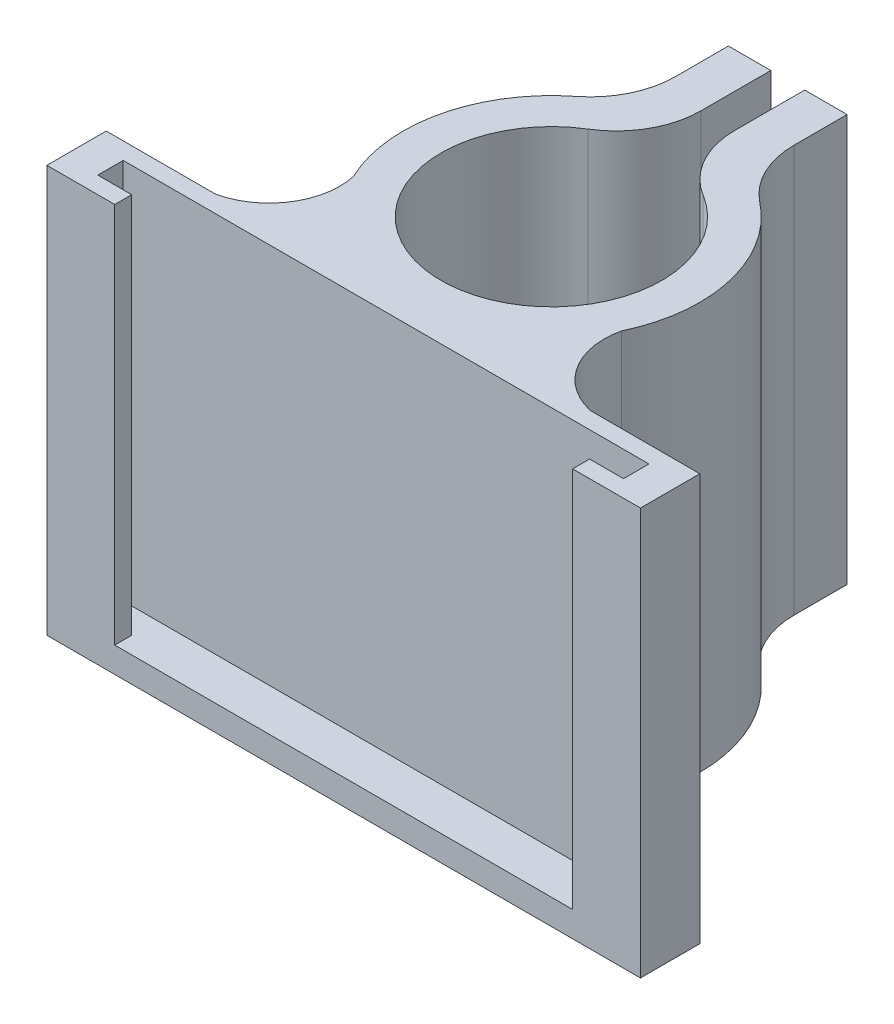
ISO-10303-21;
HEADER;
FILE_DESCRIPTION(('STEP AP214'),'2;1');
FILE_NAME('part.step','',(''),(''),'','','');
FILE_SCHEMA(('AUTOMOTIVE_DESIGN { 1 0 10303 214 1 1 1 1 }'));
ENDSEC;
DATA;
#1=APPLICATION_CONTEXT('core data for automotive mechanical design processes');
#2=APPLICATION_PROTOCOL_DEFINITION('international standard','automotive_design',2000,#1);
#3=PRODUCT_CONTEXT('',#1,'mechanical');
#4=PRODUCT('Part','Part','',(#3));
#5=PRODUCT_RELATED_PRODUCT_CATEGORY('part','',(#4));
#6=PRODUCT_DEFINITION_FORMATION('','',#4);
#7=PRODUCT_DEFINITION_CONTEXT('part definition',#1,'design');
#8=PRODUCT_DEFINITION('design','',#6,#7);
#9=PRODUCT_DEFINITION_SHAPE('','',#8);
#10=(LENGTH_UNIT() NAMED_UNIT(*) SI_UNIT(.MILLI.,.METRE.));
#11=(NAMED_UNIT(*) PLANE_ANGLE_UNIT() SI_UNIT($,.RADIAN.));
#12=(NAMED_UNIT(*) SI_UNIT($,.STERADIAN.) SOLID_ANGLE_UNIT());
#13=UNCERTAINTY_MEASURE_WITH_UNIT(LENGTH_MEASURE(1.E-05),#10,'distance_accuracy_value','');
#14=(GEOMETRIC_REPRESENTATION_CONTEXT(3) GLOBAL_UNCERTAINTY_ASSIGNED_CONTEXT((#13)) GLOBAL_UNIT_ASSIGNED_CONTEXT((#10,
#11,#12)) REPRESENTATION_CONTEXT('',''));
#15=CARTESIAN_POINT('',(0.,0.,0.));
#16=DIRECTION('',(0.,0.,1.));
#17=DIRECTION('',(1.,0.,0.));
#18=AXIS2_PLACEMENT_3D('',#15,#16,#17);
#19=CARTESIAN_POINT('',(7.,45.,-16.0390149323454));
#20=DIRECTION('',(-1.,0.,0.));
#21=DIRECTION('',(0.,0.,1.));
#22=AXIS2_PLACEMENT_3D('',#19,#20,#21);
#23=PLANE('',#22);
#24=DIRECTION('',(0.,0.,-1.));
#25=VECTOR('',#24,1.);
#26=CARTESIAN_POINT('',(7.,45.,-16.0390149323454));
#27=LINE('',#26,#25);
#28=CARTESIAN_POINT('',(7.,45.,-21.6159663212173));
#29=VERTEX_POINT('',#28);
#30=CARTESIAN_POINT('',(7.,45.,-27.8705332057378));
#31=VERTEX_POINT('',#30);
#32=EDGE_CURVE('E289',#29,#31,#27,.T.);
#33=ORIENTED_EDGE('',*,*,#32,.F.);
#34=DIRECTION('',(0.,1.,0.));
#35=VECTOR('',#34,1.);
#36=CARTESIAN_POINT('',(7.,-2.99999999999999,-21.6159663212173));
#37=LINE('',#36,#35);
#38=CARTESIAN_POINT('',(7.,-3.,-21.6159663212173));
#39=VERTEX_POINT('',#38);
#40=EDGE_CURVE('E422',#29,#39,#37,.F.);
#41=ORIENTED_EDGE('',*,*,#40,.T.);
#42=DIRECTION('',(0.,0.,1.));
#43=VECTOR('',#42,1.);
#44=CARTESIAN_POINT('',(7.,-3.,-16.0390149323454));
#45=LINE('',#44,#43);
#46=CARTESIAN_POINT('',(7.,-3.,-27.8705332057378));
#47=VERTEX_POINT('',#46);
#48=EDGE_CURVE('E275',#47,#39,#45,.T.);
#49=ORIENTED_EDGE('',*,*,#48,.F.);
#50=DIRECTION('',(0.,-1.,0.));
#51=VECTOR('',#50,1.);
#52=CARTESIAN_POINT('',(7.,45.,-27.8705332057378));
#53=LINE('',#52,#51);
#54=EDGE_CURVE('E403',#31,#47,#53,.T.);
#55=ORIENTED_EDGE('',*,*,#54,.F.);
#56=EDGE_LOOP('',(#33,#41,#49,#55));
#57=FACE_BOUND('',#56,.T.);
#58=ADVANCED_FACE('F33',(#57),#23,.F.);
#59=CARTESIAN_POINT('',(7.,45.,-27.8705332057378));
#60=DIRECTION('',(0.,0.,1.));
#61=DIRECTION('',(1.,0.,0.));
#62=AXIS2_PLACEMENT_3D('',#59,#60,#61);
#63=PLANE('',#62);
#64=ORIENTED_EDGE('',*,*,#54,.T.);
#65=DIRECTION('',(1.,0.,0.));
#66=VECTOR('',#65,1.);
#67=CARTESIAN_POINT('',(7.,-3.,-27.8705332057378));
#68=LINE('',#67,#66);
#69=CARTESIAN_POINT('',(2.,-3.,-27.8705332057378));
#70=VERTEX_POINT('',#69);
#71=EDGE_CURVE('E272',#70,#47,#68,.T.);
#72=ORIENTED_EDGE('',*,*,#71,.F.);
#73=DIRECTION('',(0.,-1.,0.));
#74=VECTOR('',#73,1.);
#75=CARTESIAN_POINT('',(2.,45.,-27.8705332057378));
#76=LINE('',#75,#74);
#77=CARTESIAN_POINT('',(2.,45.,-27.8705332057378));
#78=VERTEX_POINT('',#77);
#79=EDGE_CURVE('E401',#78,#70,#76,.T.);
#80=ORIENTED_EDGE('',*,*,#79,.F.);
#81=DIRECTION('',(-1.,0.,0.));
#82=VECTOR('',#81,1.);
#83=CARTESIAN_POINT('',(7.,45.,-27.8705332057378));
#84=LINE('',#83,#82);
#85=EDGE_CURVE('E291',#31,#78,#84,.T.);
#86=ORIENTED_EDGE('',*,*,#85,.F.);
#87=EDGE_LOOP('',(#64,#72,#80,#86));
#88=FACE_BOUND('',#87,.T.);
#89=ADVANCED_FACE('F478',(#88),#63,.F.);
#90=CARTESIAN_POINT('',(2.,45.,-18.8705332057378));
#91=DIRECTION('',(1.,0.,0.));
#92=DIRECTION('',(0.,0.,-1.));
#93=AXIS2_PLACEMENT_3D('',#90,#91,#92);
#94=PLANE('',#93);
#95=ORIENTED_EDGE('',*,*,#79,.T.);
#96=DIRECTION('',(0.,0.,-1.));
#97=VECTOR('',#96,1.);
#98=CARTESIAN_POINT('',(2.,-3.,-27.8705332057378));
#99=LINE('',#98,#97);
#100=CARTESIAN_POINT('',(2.,-3.,-19.6507156358235));
#101=VERTEX_POINT('',#100);
#102=EDGE_CURVE('E269',#101,#70,#99,.T.);
#103=ORIENTED_EDGE('',*,*,#102,.F.);
#104=DIRECTION('',(0.,-1.,0.));
#105=VECTOR('',#104,1.);
#106=CARTESIAN_POINT('',(2.,45.,-19.6507156358235));
#107=LINE('',#106,#105);
#108=CARTESIAN_POINT('',(2.,45.,-19.6507156358235));
#109=VERTEX_POINT('',#108);
#110=EDGE_CURVE('E409',#101,#109,#107,.F.);
#111=ORIENTED_EDGE('',*,*,#110,.T.);
#112=DIRECTION('',(0.,0.,1.));
#113=VECTOR('',#112,1.);
#114=CARTESIAN_POINT('',(2.,45.,-27.8705332057378));
#115=LINE('',#114,#113);
#116=EDGE_CURVE('E294',#78,#109,#115,.T.);
#117=ORIENTED_EDGE('',*,*,#116,.F.);
#118=EDGE_LOOP('',(#95,#103,#111,#117));
#119=FACE_BOUND('',#118,.T.);
#120=ADVANCED_FACE('F473',(#119),#94,.F.);
#121=CARTESIAN_POINT('',(0.,45.,0.));
#122=DIRECTION('',(0.,-1.,0.));
#123=DIRECTION('',(0.,0.,-1.));
#124=AXIS2_PLACEMENT_3D('',#121,#122,#123);
#125=CYLINDRICAL_SURFACE('',#124,13.025);
#126=CARTESIAN_POINT('',(0.,45.,0.));
#127=DIRECTION('',(0.,-1.,0.));
#128=DIRECTION('',(0.,0.,1.));
#129=AXIS2_PLACEMENT_3D('',#126,#127,#128);
#130=CIRCLE('',#129,13.025);
#131=CARTESIAN_POINT('',(6.78827361563518,45.,-11.1162028732509));
#132=VERTEX_POINT('',#131);
#133=CARTESIAN_POINT('',(-6.78827361563518,45.,-11.1162028732509));
#134=VERTEX_POINT('',#133);
#135=EDGE_CURVE('E297',#132,#134,#130,.T.);
#136=ORIENTED_EDGE('',*,*,#135,.F.);
#137=DIRECTION('',(0.,-1.,0.));
#138=VECTOR('',#137,1.);
#139=CARTESIAN_POINT('',(6.78827361563518,45.,-11.1162028732509));
#140=LINE('',#139,#138);
#141=CARTESIAN_POINT('',(6.78827361563518,-3.,-11.1162028732509));
#142=VERTEX_POINT('',#141);
#143=EDGE_CURVE('E407',#132,#142,#140,.T.);
#144=ORIENTED_EDGE('',*,*,#143,.T.);
#145=CARTESIAN_POINT('',(0.,-3.,0.));
#146=DIRECTION('',(0.,1.,0.));
#147=DIRECTION('',(0.,0.,-1.));
#148=AXIS2_PLACEMENT_3D('',#145,#146,#147);
#149=CIRCLE('',#148,13.025);
#150=CARTESIAN_POINT('',(-6.78827361563518,-3.,-11.1162028732509));
#151=VERTEX_POINT('',#150);
#152=EDGE_CURVE('E263',#151,#142,#149,.T.);
#153=ORIENTED_EDGE('',*,*,#152,.F.);
#154=DIRECTION('',(0.,-1.,0.));
#155=VECTOR('',#154,1.);
#156=CARTESIAN_POINT('',(-6.78827361563518,45.,-11.1162028732509));
#157=LINE('',#156,#155);
#158=EDGE_CURVE('E405',#151,#134,#157,.F.);
#159=ORIENTED_EDGE('',*,*,#158,.T.);
#160=EDGE_LOOP('',(#136,#144,#153,#159));
#161=FACE_BOUND('',#160,.T.);
#162=ADVANCED_FACE('F465',(#161),#125,.F.);
#163=CARTESIAN_POINT('',(-2.,45.,-27.8705332057378));
#164=DIRECTION('',(-1.,0.,0.));
#165=DIRECTION('',(0.,0.,1.));
#166=AXIS2_PLACEMENT_3D('',#163,#164,#165);
#167=PLANE('',#166);
#168=DIRECTION('',(0.,0.,-1.));
#169=VECTOR('',#168,1.);
#170=CARTESIAN_POINT('',(-2.,45.,-18.8705332057378));
#171=LINE('',#170,#169);
#172=CARTESIAN_POINT('',(-2.,45.,-19.6507156358235));
#173=VERTEX_POINT('',#172);
#174=CARTESIAN_POINT('',(-2.,45.,-27.8705332057378));
#175=VERTEX_POINT('',#174);
#176=EDGE_CURVE('E300',#173,#175,#171,.T.);
#177=ORIENTED_EDGE('',*,*,#176,.F.);
#178=DIRECTION('',(0.,-1.,0.));
#179=VECTOR('',#178,1.);
#180=CARTESIAN_POINT('',(-2.,45.,-19.6507156358235));
#181=LINE('',#180,#179);
#182=CARTESIAN_POINT('',(-2.,-3.,-19.6507156358235));
#183=VERTEX_POINT('',#182);
#184=EDGE_CURVE('E415',#173,#183,#181,.T.);
#185=ORIENTED_EDGE('',*,*,#184,.T.);
#186=DIRECTION('',(0.,0.,1.));
#187=VECTOR('',#186,1.);
#188=CARTESIAN_POINT('',(-2.,-3.,-19.6507156358235));
#189=LINE('',#188,#187);
#190=CARTESIAN_POINT('',(-2.,-3.,-27.8705332057378));
#191=VERTEX_POINT('',#190);
#192=EDGE_CURVE('E257',#191,#183,#189,.T.);
#193=ORIENTED_EDGE('',*,*,#192,.F.);
#194=DIRECTION('',(0.,-1.,0.));
#195=VECTOR('',#194,1.);
#196=CARTESIAN_POINT('',(-2.,45.,-27.8705332057378));
#197=LINE('',#196,#195);
#198=EDGE_CURVE('E399',#175,#191,#197,.T.);
#199=ORIENTED_EDGE('',*,*,#198,.F.);
#200=EDGE_LOOP('',(#177,#185,#193,#199));
#201=FACE_BOUND('',#200,.T.);
#202=ADVANCED_FACE('F456',(#201),#167,.F.);
#203=CARTESIAN_POINT('',(-7.,45.,-27.8705332057378));
#204=DIRECTION('',(0.,0.,1.));
#205=DIRECTION('',(1.,0.,0.));
#206=AXIS2_PLACEMENT_3D('',#203,#204,#205);
#207=PLANE('',#206);
#208=ORIENTED_EDGE('',*,*,#198,.T.);
#209=DIRECTION('',(1.,0.,0.));
#210=VECTOR('',#209,1.);
#211=CARTESIAN_POINT('',(-2.,-3.,-27.8705332057378));
#212=LINE('',#211,#210);
#213=CARTESIAN_POINT('',(-7.,-3.,-27.8705332057378));
#214=VERTEX_POINT('',#213);
#215=EDGE_CURVE('E254',#214,#191,#212,.T.);
#216=ORIENTED_EDGE('',*,*,#215,.F.);
#217=DIRECTION('',(0.,-1.,0.));
#218=VECTOR('',#217,1.);
#219=CARTESIAN_POINT('',(-7.,45.,-27.8705332057378));
#220=LINE('',#219,#218);
#221=CARTESIAN_POINT('',(-7.,45.,-27.8705332057378));
#222=VERTEX_POINT('',#221);
#223=EDGE_CURVE('E396',#222,#214,#220,.T.);
#224=ORIENTED_EDGE('',*,*,#223,.F.);
#225=DIRECTION('',(-1.,0.,0.));
#226=VECTOR('',#225,1.);
#227=CARTESIAN_POINT('',(-7.,45.,-27.8705332057378));
#228=LINE('',#227,#226);
#229=EDGE_CURVE('E302',#175,#222,#228,.T.);
#230=ORIENTED_EDGE('',*,*,#229,.F.);
#231=EDGE_LOOP('',(#208,#216,#224,#230));
#232=FACE_BOUND('',#231,.T.);
#233=ADVANCED_FACE('F450',(#232),#207,.F.);
#234=CARTESIAN_POINT('',(-7.,45.,-16.0390149323454));
#235=DIRECTION('',(1.,0.,0.));
#236=DIRECTION('',(0.,0.,-1.));
#237=AXIS2_PLACEMENT_3D('',#234,#235,#236);
#238=PLANE('',#237);
#239=DIRECTION('',(0.,0.,-1.));
#240=VECTOR('',#239,1.);
#241=CARTESIAN_POINT('',(-7.,-3.,-27.8705332057378));
#242=LINE('',#241,#240);
#243=CARTESIAN_POINT('',(-7.,-3.,-21.6159663212173));
#244=VERTEX_POINT('',#243);
#245=EDGE_CURVE('E252',#244,#214,#242,.T.);
#246=ORIENTED_EDGE('',*,*,#245,.F.);
#247=DIRECTION('',(0.,1.,0.));
#248=VECTOR('',#247,1.);
#249=CARTESIAN_POINT('',(-7.,45.,-21.6159663212173));
#250=LINE('',#249,#248);
#251=CARTESIAN_POINT('',(-7.,45.,-21.6159663212173));
#252=VERTEX_POINT('',#251);
#253=EDGE_CURVE('E420',#244,#252,#250,.T.);
#254=ORIENTED_EDGE('',*,*,#253,.T.);
#255=DIRECTION('',(0.,0.,1.));
#256=VECTOR('',#255,1.);
#257=CARTESIAN_POINT('',(-7.,45.,-16.0390149323454));
#258=LINE('',#257,#256);
#259=EDGE_CURVE('E304',#222,#252,#258,.T.);
#260=ORIENTED_EDGE('',*,*,#259,.F.);
#261=ORIENTED_EDGE('',*,*,#223,.T.);
#262=EDGE_LOOP('',(#246,#254,#260,#261));
#263=FACE_BOUND('',#262,.T.);
#264=ADVANCED_FACE('F445',(#263),#238,.F.);
#265=CARTESIAN_POINT('',(0.,45.,0.));
#266=DIRECTION('',(0.,-1.,0.));
#267=DIRECTION('',(0.,0.,-1.));
#268=AXIS2_PLACEMENT_3D('',#265,#266,#267);
#269=CYLINDRICAL_SURFACE('',#268,17.5);
#270=CARTESIAN_POINT('',(0.,45.,0.));
#271=DIRECTION('',(0.,1.,0.));
#272=DIRECTION('',(0.,0.,1.));
#273=AXIS2_PLACEMENT_3D('',#270,#271,#272);
#274=CIRCLE('',#273,17.5);
#275=CARTESIAN_POINT('',(-10.8181818181818,45.,-13.7556149316837));
#276=VERTEX_POINT('',#275);
#277=CARTESIAN_POINT('',(-15.794877566593,45.,7.53470919520709));
#278=VERTEX_POINT('',#277);
#279=EDGE_CURVE('E307',#276,#278,#274,.T.);
#280=ORIENTED_EDGE('',*,*,#279,.F.);
#281=DIRECTION('',(0.,-1.,0.));
#282=VECTOR('',#281,1.);
#283=CARTESIAN_POINT('',(-10.8181818181818,45.,-13.7556149316837));
#284=LINE('',#283,#282);
#285=CARTESIAN_POINT('',(-10.8181818181818,-3.,-13.7556149316837));
#286=VERTEX_POINT('',#285);
#287=EDGE_CURVE('E417',#276,#286,#284,.T.);
#288=ORIENTED_EDGE('',*,*,#287,.T.);
#289=CARTESIAN_POINT('',(0.,-3.,0.));
#290=DIRECTION('',(0.,-1.,0.));
#291=DIRECTION('',(0.,0.,-1.));
#292=AXIS2_PLACEMENT_3D('',#289,#290,#291);
#293=CIRCLE('',#292,17.5);
#294=CARTESIAN_POINT('',(-15.794877566593,-3.,7.5347091952071));
#295=VERTEX_POINT('',#294);
#296=EDGE_CURVE('E249',#295,#286,#293,.T.);
#297=ORIENTED_EDGE('',*,*,#296,.F.);
#298=DIRECTION('',(0.,-1.,0.));
#299=VECTOR('',#298,1.);
#300=CARTESIAN_POINT('',(-15.794877566593,45.,7.53470919520709));
#301=LINE('',#300,#299);
#302=EDGE_CURVE('E394',#278,#295,#301,.T.);
#303=ORIENTED_EDGE('',*,*,#302,.F.);
#304=EDGE_LOOP('',(#280,#288,#297,#303));
#305=FACE_BOUND('',#304,.T.);
#306=ADVANCED_FACE('F439',(#305),#269,.T.);
#307=CARTESIAN_POINT('',(-23.9286772002406,45.,9.36620036635238));
#308=DIRECTION('',(0.,-1.,0.));
#309=DIRECTION('',(0.,0.,-1.));
#310=AXIS2_PLACEMENT_3D('',#307,#308,#309);
#311=CYLINDRICAL_SURFACE('',#310,8.33744903374584);
#312=ORIENTED_EDGE('',*,*,#302,.T.);
#313=CARTESIAN_POINT('',(-23.9286772002406,-3.,9.36620036635238));
#314=DIRECTION('',(0.,1.,0.));
#315=DIRECTION('',(0.,0.,-1.));
#316=AXIS2_PLACEMENT_3D('',#313,#314,#315);
#317=CIRCLE('',#316,8.33744903374584);
#318=CARTESIAN_POINT('',(-22.0971860290953,-3.,17.5));
#319=VERTEX_POINT('',#318);
#320=EDGE_CURVE('E236',#319,#295,#317,.T.);
#321=ORIENTED_EDGE('',*,*,#320,.F.);
#322=DIRECTION('',(0.,-1.,0.));
#323=VECTOR('',#322,1.);
#324=CARTESIAN_POINT('',(-22.0971860290953,45.,17.5));
#325=LINE('',#324,#323);
#326=CARTESIAN_POINT('',(-22.0971860290953,45.,17.5));
#327=VERTEX_POINT('',#326);
#328=EDGE_CURVE('E227',#327,#319,#325,.T.);
#329=ORIENTED_EDGE('',*,*,#328,.F.);
#330=CARTESIAN_POINT('',(-23.9286772002406,45.,9.36620036635238));
#331=DIRECTION('',(0.,-1.,0.));
#332=DIRECTION('',(0.,0.,1.));
#333=AXIS2_PLACEMENT_3D('',#330,#331,#332);
#334=CIRCLE('',#333,8.33744903374584);
#335=EDGE_CURVE('E309',#278,#327,#334,.T.);
#336=ORIENTED_EDGE('',*,*,#335,.F.);
#337=EDGE_LOOP('',(#312,#321,#329,#336));
#338=FACE_BOUND('',#337,.T.);
#339=ADVANCED_FACE('F511',(#338),#311,.F.);
#340=CARTESIAN_POINT('',(-22.0971860290953,45.,17.5));
#341=DIRECTION('',(0.,0.,1.));
#342=DIRECTION('',(1.,0.,0.));
#343=AXIS2_PLACEMENT_3D('',#340,#341,#342);
#344=PLANE('',#343);
#345=ORIENTED_EDGE('',*,*,#328,.T.);
#346=DIRECTION('',(1.,0.,0.));
#347=VECTOR('',#346,1.);
#348=CARTESIAN_POINT('',(-35.,-3.,17.5));
#349=LINE('',#348,#347);
#350=CARTESIAN_POINT('',(-35.,-3.,17.5));
#351=VERTEX_POINT('',#350);
#352=EDGE_CURVE('E231',#351,#319,#349,.T.);
#353=ORIENTED_EDGE('',*,*,#352,.F.);
#354=DIRECTION('',(0.,-1.,0.));
#355=VECTOR('',#354,1.);
#356=CARTESIAN_POINT('',(-35.,45.,17.5));
#357=LINE('',#356,#355);
#358=CARTESIAN_POINT('',(-35.,45.,17.5));
#359=VERTEX_POINT('',#358);
#360=EDGE_CURVE('E218',#359,#351,#357,.T.);
#361=ORIENTED_EDGE('',*,*,#360,.F.);
#362=DIRECTION('',(-1.,0.,0.));
#363=VECTOR('',#362,1.);
#364=CARTESIAN_POINT('',(-22.0971860290953,45.,17.5));
#365=LINE('',#364,#363);
#366=EDGE_CURVE('E311',#327,#359,#365,.T.);
#367=ORIENTED_EDGE('',*,*,#366,.F.);
#368=EDGE_LOOP('',(#345,#353,#361,#367));
#369=FACE_BOUND('',#368,.T.);
#370=ADVANCED_FACE('F232',(#369),#344,.F.);
#371=CARTESIAN_POINT('',(-35.,45.,17.5));
#372=DIRECTION('',(1.,0.,0.));
#373=DIRECTION('',(0.,0.,-1.));
#374=AXIS2_PLACEMENT_3D('',#371,#372,#373);
#375=PLANE('',#374);
#376=ORIENTED_EDGE('',*,*,#360,.T.);
#377=DIRECTION('',(0.,0.,-1.));
#378=VECTOR('',#377,1.);
#379=CARTESIAN_POINT('',(-35.,-3.,24.5));
#380=LINE('',#379,#378);
#381=CARTESIAN_POINT('',(-35.,-3.,24.5));
#382=VERTEX_POINT('',#381);
#383=EDGE_CURVE('E223',#382,#351,#380,.T.);
#384=ORIENTED_EDGE('',*,*,#383,.F.);
#385=DIRECTION('',(0.,-1.,0.));
#386=VECTOR('',#385,1.);
#387=CARTESIAN_POINT('',(-35.,45.,24.5));
#388=LINE('',#387,#386);
#389=CARTESIAN_POINT('',(-35.,45.,24.5));
#390=VERTEX_POINT('',#389);
#391=EDGE_CURVE('E228',#390,#382,#388,.T.);
#392=ORIENTED_EDGE('',*,*,#391,.F.);
#393=DIRECTION('',(0.,0.,1.));
#394=VECTOR('',#393,1.);
#395=CARTESIAN_POINT('',(-35.,45.,17.5));
#396=LINE('',#395,#394);
#397=EDGE_CURVE('E224',#359,#390,#396,.T.);
#398=ORIENTED_EDGE('',*,*,#397,.F.);
#399=EDGE_LOOP('',(#376,#384,#392,#398));
#400=FACE_BOUND('',#399,.T.);
#401=ADVANCED_FACE('F220',(#400),#375,.F.);
#402=CARTESIAN_POINT('',(-27.,45.,24.5));
#403=DIRECTION('',(-1.,0.,0.));
#404=DIRECTION('',(0.,0.,1.));
#405=AXIS2_PLACEMENT_3D('',#402,#403,#404);
#406=PLANE('',#405);
#407=DIRECTION('',(0.,0.,-1.));
#408=VECTOR('',#407,1.);
#409=CARTESIAN_POINT('',(-27.,0.,24.5));
#410=LINE('',#409,#408);
#411=CARTESIAN_POINT('',(-27.,0.,24.5));
#412=VERTEX_POINT('',#411);
#413=CARTESIAN_POINT('',(-27.,0.,22.5));
#414=VERTEX_POINT('',#413);
#415=EDGE_CURVE('E287',#412,#414,#410,.T.);
#416=ORIENTED_EDGE('',*,*,#415,.T.);
#417=DIRECTION('',(0.,-1.,0.));
#418=VECTOR('',#417,1.);
#419=CARTESIAN_POINT('',(-27.,45.,22.5));
#420=LINE('',#419,#418);
#421=CARTESIAN_POINT('',(-27.,45.,22.5));
#422=VERTEX_POINT('',#421);
#423=EDGE_CURVE('E386',#422,#414,#420,.T.);
#424=ORIENTED_EDGE('',*,*,#423,.F.);
#425=DIRECTION('',(0.,0.,-1.));
#426=VECTOR('',#425,1.);
#427=CARTESIAN_POINT('',(-27.,45.,24.5));
#428=LINE('',#427,#426);
#429=CARTESIAN_POINT('',(-27.,45.,24.5));
#430=VERTEX_POINT('',#429);
#431=EDGE_CURVE('E316',#430,#422,#428,.T.);
#432=ORIENTED_EDGE('',*,*,#431,.F.);
#433=DIRECTION('',(0.,-1.,0.));
#434=VECTOR('',#433,1.);
#435=CARTESIAN_POINT('',(-27.,45.,24.5));
#436=LINE('',#435,#434);
#437=EDGE_CURVE('E389',#430,#412,#436,.T.);
#438=ORIENTED_EDGE('',*,*,#437,.T.);
#439=EDGE_LOOP('',(#416,#424,#432,#438));
#440=FACE_BOUND('',#439,.T.);
#441=ADVANCED_FACE('F579',(#440),#406,.F.);
#442=CARTESIAN_POINT('',(-27.,45.,22.5));
#443=DIRECTION('',(0.,0.,1.));
#444=DIRECTION('',(1.,0.,0.));
#445=AXIS2_PLACEMENT_3D('',#442,#443,#444);
#446=PLANE('',#445);
#447=DIRECTION('',(-1.,0.,0.));
#448=VECTOR('',#447,1.);
#449=CARTESIAN_POINT('',(-27.,0.,22.5));
#450=LINE('',#449,#448);
#451=CARTESIAN_POINT('',(-31.,0.,22.5));
#452=VERTEX_POINT('',#451);
#453=EDGE_CURVE('E343',#414,#452,#450,.T.);
#454=ORIENTED_EDGE('',*,*,#453,.T.);
#455=DIRECTION('',(0.,-1.,0.));
#456=VECTOR('',#455,1.);
#457=CARTESIAN_POINT('',(-31.,45.,22.5));
#458=LINE('',#457,#456);
#459=CARTESIAN_POINT('',(-31.,45.,22.5));
#460=VERTEX_POINT('',#459);
#461=EDGE_CURVE('E383',#460,#452,#458,.T.);
#462=ORIENTED_EDGE('',*,*,#461,.F.);
#463=DIRECTION('',(-1.,0.,0.));
#464=VECTOR('',#463,1.);
#465=CARTESIAN_POINT('',(-27.,45.,22.5));
#466=LINE('',#465,#464);
#467=EDGE_CURVE('E318',#422,#460,#466,.T.);
#468=ORIENTED_EDGE('',*,*,#467,.F.);
#469=ORIENTED_EDGE('',*,*,#423,.T.);
#470=EDGE_LOOP('',(#454,#462,#468,#469));
#471=FACE_BOUND('',#470,.T.);
#472=ADVANCED_FACE('F575',(#471),#446,.F.);
#473=CARTESIAN_POINT('',(-31.,45.,22.5));
#474=DIRECTION('',(-1.,0.,0.));
#475=DIRECTION('',(0.,0.,1.));
#476=AXIS2_PLACEMENT_3D('',#473,#474,#475);
#477=PLANE('',#476);
#478=DIRECTION('',(0.,0.,-1.));
#479=VECTOR('',#478,1.);
#480=CARTESIAN_POINT('',(-31.,0.,22.5));
#481=LINE('',#480,#479);
#482=CARTESIAN_POINT('',(-31.,0.,19.5));
#483=VERTEX_POINT('',#482);
#484=EDGE_CURVE('E346',#452,#483,#481,.T.);
#485=ORIENTED_EDGE('',*,*,#484,.T.);
#486=DIRECTION('',(0.,-1.,0.));
#487=VECTOR('',#486,1.);
#488=CARTESIAN_POINT('',(-31.,45.,19.5));
#489=LINE('',#488,#487);
#490=CARTESIAN_POINT('',(-31.,45.,19.5));
#491=VERTEX_POINT('',#490);
#492=EDGE_CURVE('E380',#491,#483,#489,.T.);
#493=ORIENTED_EDGE('',*,*,#492,.F.);
#494=DIRECTION('',(0.,0.,-1.));
#495=VECTOR('',#494,1.);
#496=CARTESIAN_POINT('',(-31.,45.,22.5));
#497=LINE('',#496,#495);
#498=EDGE_CURVE('E320',#460,#491,#497,.T.);
#499=ORIENTED_EDGE('',*,*,#498,.F.);
#500=ORIENTED_EDGE('',*,*,#461,.T.);
#501=EDGE_LOOP('',(#485,#493,#499,#500));
#502=FACE_BOUND('',#501,.T.);
#503=ADVANCED_FACE('F571',(#502),#477,.F.);
#504=CARTESIAN_POINT('',(31.,45.,19.5));
#505=DIRECTION('',(0.,0.,-1.));
#506=DIRECTION('',(-1.,0.,0.));
#507=AXIS2_PLACEMENT_3D('',#504,#505,#506);
#508=PLANE('',#507);
#509=DIRECTION('',(1.,0.,0.));
#510=VECTOR('',#509,1.);
#511=CARTESIAN_POINT('',(31.,0.,19.5));
#512=LINE('',#511,#510);
#513=CARTESIAN_POINT('',(31.,0.,19.5));
#514=VERTEX_POINT('',#513);
#515=EDGE_CURVE('E349',#483,#514,#512,.T.);
#516=ORIENTED_EDGE('',*,*,#515,.T.);
#517=DIRECTION('',(0.,-1.,0.));
#518=VECTOR('',#517,1.);
#519=CARTESIAN_POINT('',(31.,45.,19.5));
#520=LINE('',#519,#518);
#521=CARTESIAN_POINT('',(31.,45.,19.5));
#522=VERTEX_POINT('',#521);
#523=EDGE_CURVE('E377',#522,#514,#520,.T.);
#524=ORIENTED_EDGE('',*,*,#523,.F.);
#525=DIRECTION('',(1.,0.,0.));
#526=VECTOR('',#525,1.);
#527=CARTESIAN_POINT('',(31.,45.,19.5));
#528=LINE('',#527,#526);
#529=EDGE_CURVE('E322',#491,#522,#528,.T.);
#530=ORIENTED_EDGE('',*,*,#529,.F.);
#531=ORIENTED_EDGE('',*,*,#492,.T.);
#532=EDGE_LOOP('',(#516,#524,#530,#531));
#533=FACE_BOUND('',#532,.T.);
#534=ADVANCED_FACE('F567',(#533),#508,.F.);
#535=CARTESIAN_POINT('',(31.,45.,22.5));
#536=DIRECTION('',(1.,0.,0.));
#537=DIRECTION('',(0.,0.,-1.));
#538=AXIS2_PLACEMENT_3D('',#535,#536,#537);
#539=PLANE('',#538);
#540=DIRECTION('',(0.,0.,1.));
#541=VECTOR('',#540,1.);
#542=CARTESIAN_POINT('',(31.,0.,22.5));
#543=LINE('',#542,#541);
#544=CARTESIAN_POINT('',(31.,0.,22.5));
#545=VERTEX_POINT('',#544);
#546=EDGE_CURVE('E352',#514,#545,#543,.T.);
#547=ORIENTED_EDGE('',*,*,#546,.T.);
#548=DIRECTION('',(0.,-1.,0.));
#549=VECTOR('',#548,1.);
#550=CARTESIAN_POINT('',(31.,45.,22.5));
#551=LINE('',#550,#549);
#552=CARTESIAN_POINT('',(31.,45.,22.5));
#553=VERTEX_POINT('',#552);
#554=EDGE_CURVE('E374',#553,#545,#551,.T.);
#555=ORIENTED_EDGE('',*,*,#554,.F.);
#556=DIRECTION('',(0.,0.,1.));
#557=VECTOR('',#556,1.);
#558=CARTESIAN_POINT('',(31.,45.,22.5));
#559=LINE('',#558,#557);
#560=EDGE_CURVE('E324',#522,#553,#559,.T.);
#561=ORIENTED_EDGE('',*,*,#560,.F.);
#562=ORIENTED_EDGE('',*,*,#523,.T.);
#563=EDGE_LOOP('',(#547,#555,#561,#562));
#564=FACE_BOUND('',#563,.T.);
#565=ADVANCED_FACE('F563',(#564),#539,.F.);
#566=CARTESIAN_POINT('',(27.,45.,22.5));
#567=DIRECTION('',(0.,0.,1.));
#568=DIRECTION('',(1.,0.,0.));
#569=AXIS2_PLACEMENT_3D('',#566,#567,#568);
#570=PLANE('',#569);
#571=DIRECTION('',(-1.,0.,0.));
#572=VECTOR('',#571,1.);
#573=CARTESIAN_POINT('',(27.,0.,22.5));
#574=LINE('',#573,#572);
#575=CARTESIAN_POINT('',(27.,0.,22.5));
#576=VERTEX_POINT('',#575);
#577=EDGE_CURVE('E355',#545,#576,#574,.T.);
#578=ORIENTED_EDGE('',*,*,#577,.T.);
#579=DIRECTION('',(0.,-1.,0.));
#580=VECTOR('',#579,1.);
#581=CARTESIAN_POINT('',(27.,45.,22.5));
#582=LINE('',#581,#580);
#583=CARTESIAN_POINT('',(27.,45.,22.5));
#584=VERTEX_POINT('',#583);
#585=EDGE_CURVE('E371',#584,#576,#582,.T.);
#586=ORIENTED_EDGE('',*,*,#585,.F.);
#587=DIRECTION('',(-1.,0.,0.));
#588=VECTOR('',#587,1.);
#589=CARTESIAN_POINT('',(27.,45.,22.5));
#590=LINE('',#589,#588);
#591=EDGE_CURVE('E326',#553,#584,#590,.T.);
#592=ORIENTED_EDGE('',*,*,#591,.F.);
#593=ORIENTED_EDGE('',*,*,#554,.T.);
#594=EDGE_LOOP('',(#578,#586,#592,#593));
#595=FACE_BOUND('',#594,.T.);
#596=ADVANCED_FACE('F559',(#595),#570,.F.);
#597=CARTESIAN_POINT('',(27.,45.,24.5));
#598=DIRECTION('',(1.,0.,0.));
#599=DIRECTION('',(0.,0.,-1.));
#600=AXIS2_PLACEMENT_3D('',#597,#598,#599);
#601=PLANE('',#600);
#602=DIRECTION('',(0.,0.,1.));
#603=VECTOR('',#602,1.);
#604=CARTESIAN_POINT('',(27.,0.,24.5));
#605=LINE('',#604,#603);
#606=CARTESIAN_POINT('',(27.,0.,24.5));
#607=VERTEX_POINT('',#606);
#608=EDGE_CURVE('E292',#576,#607,#605,.T.);
#609=ORIENTED_EDGE('',*,*,#608,.T.);
#610=DIRECTION('',(0.,-1.,0.));
#611=VECTOR('',#610,1.);
#612=CARTESIAN_POINT('',(27.,45.,24.5));
#613=LINE('',#612,#611);
#614=CARTESIAN_POINT('',(27.,45.,24.5));
#615=VERTEX_POINT('',#614);
#616=EDGE_CURVE('E368',#615,#607,#613,.T.);
#617=ORIENTED_EDGE('',*,*,#616,.F.);
#618=DIRECTION('',(0.,0.,1.));
#619=VECTOR('',#618,1.);
#620=CARTESIAN_POINT('',(27.,45.,24.5));
#621=LINE('',#620,#619);
#622=EDGE_CURVE('E328',#584,#615,#621,.T.);
#623=ORIENTED_EDGE('',*,*,#622,.F.);
#624=ORIENTED_EDGE('',*,*,#585,.T.);
#625=EDGE_LOOP('',(#609,#617,#623,#624));
#626=FACE_BOUND('',#625,.T.);
#627=ADVANCED_FACE('F556',(#626),#601,.F.);
#628=CARTESIAN_POINT('',(35.,45.,24.5));
#629=DIRECTION('',(0.,0.,-1.));
#630=DIRECTION('',(-1.,0.,0.));
#631=AXIS2_PLACEMENT_3D('',#628,#629,#630);
#632=PLANE('',#631);
#633=ORIENTED_EDGE('',*,*,#616,.T.);
#634=DIRECTION('',(-1.,0.,0.));
#635=VECTOR('',#634,1.);
#636=CARTESIAN_POINT('',(-35.,0.,24.5));
#637=LINE('',#636,#635);
#638=EDGE_CURVE('E243',#607,#412,#637,.T.);
#639=ORIENTED_EDGE('',*,*,#638,.T.);
#640=ORIENTED_EDGE('',*,*,#437,.F.);
#641=DIRECTION('',(1.,0.,0.));
#642=VECTOR('',#641,1.);
#643=CARTESIAN_POINT('',(-35.,45.,24.5));
#644=LINE('',#643,#642);
#645=EDGE_CURVE('E314',#390,#430,#644,.T.);
#646=ORIENTED_EDGE('',*,*,#645,.F.);
#647=ORIENTED_EDGE('',*,*,#391,.T.);
#648=DIRECTION('',(-1.,0.,0.));
#649=VECTOR('',#648,1.);
#650=CARTESIAN_POINT('',(-35.,-3.,24.5));
#651=LINE('',#650,#649);
#652=CARTESIAN_POINT('',(35.,-3.,24.5));
#653=VERTEX_POINT('',#652);
#654=EDGE_CURVE('E242',#653,#382,#651,.T.);
#655=ORIENTED_EDGE('',*,*,#654,.F.);
#656=DIRECTION('',(0.,-1.,0.));
#657=VECTOR('',#656,1.);
#658=CARTESIAN_POINT('',(35.,45.,24.5));
#659=LINE('',#658,#657);
#660=CARTESIAN_POINT('',(35.,45.,24.5));
#661=VERTEX_POINT('',#660);
#662=EDGE_CURVE('E366',#661,#653,#659,.T.);
#663=ORIENTED_EDGE('',*,*,#662,.F.);
#664=DIRECTION('',(1.,0.,0.));
#665=VECTOR('',#664,1.);
#666=CARTESIAN_POINT('',(35.,45.,24.5));
#667=LINE('',#666,#665);
#668=EDGE_CURVE('E330',#615,#661,#667,.T.);
#669=ORIENTED_EDGE('',*,*,#668,.F.);
#670=EDGE_LOOP('',(#633,#639,#640,#646,#647,#655,#663,#669));
#671=FACE_BOUND('',#670,.T.);
#672=ADVANCED_FACE('F504',(#671),#632,.F.);
#673=CARTESIAN_POINT('',(35.,45.,17.5));
#674=DIRECTION('',(-1.,0.,0.));
#675=DIRECTION('',(0.,0.,1.));
#676=AXIS2_PLACEMENT_3D('',#673,#674,#675);
#677=PLANE('',#676);
#678=ORIENTED_EDGE('',*,*,#662,.T.);
#679=DIRECTION('',(0.,0.,1.));
#680=VECTOR('',#679,1.);
#681=CARTESIAN_POINT('',(35.,-3.,24.5));
#682=LINE('',#681,#680);
#683=CARTESIAN_POINT('',(35.,-3.,17.5));
#684=VERTEX_POINT('',#683);
#685=EDGE_CURVE('E285',#684,#653,#682,.T.);
#686=ORIENTED_EDGE('',*,*,#685,.F.);
#687=DIRECTION('',(0.,-1.,0.));
#688=VECTOR('',#687,1.);
#689=CARTESIAN_POINT('',(35.,45.,17.5));
#690=LINE('',#689,#688);
#691=CARTESIAN_POINT('',(35.,45.,17.5));
#692=VERTEX_POINT('',#691);
#693=EDGE_CURVE('E364',#692,#684,#690,.T.);
#694=ORIENTED_EDGE('',*,*,#693,.F.);
#695=DIRECTION('',(0.,0.,-1.));
#696=VECTOR('',#695,1.);
#697=CARTESIAN_POINT('',(35.,45.,17.5));
#698=LINE('',#697,#696);
#699=EDGE_CURVE('E332',#661,#692,#698,.T.);
#700=ORIENTED_EDGE('',*,*,#699,.F.);
#701=EDGE_LOOP('',(#678,#686,#694,#700));
#702=FACE_BOUND('',#701,.T.);
#703=ADVANCED_FACE('F501',(#702),#677,.F.);
#704=CARTESIAN_POINT('',(22.0971860290953,45.,17.5));
#705=DIRECTION('',(0.,0.,1.));
#706=DIRECTION('',(1.,0.,0.));
#707=AXIS2_PLACEMENT_3D('',#704,#705,#706);
#708=PLANE('',#707);
#709=ORIENTED_EDGE('',*,*,#693,.T.);
#710=DIRECTION('',(1.,0.,0.));
#711=VECTOR('',#710,1.);
#712=CARTESIAN_POINT('',(22.0971860290953,-3.,17.5));
#713=LINE('',#712,#711);
#714=CARTESIAN_POINT('',(22.0971860290953,-3.,17.5));
#715=VERTEX_POINT('',#714);
#716=EDGE_CURVE('E282',#715,#684,#713,.T.);
#717=ORIENTED_EDGE('',*,*,#716,.F.);
#718=DIRECTION('',(0.,-1.,0.));
#719=VECTOR('',#718,1.);
#720=CARTESIAN_POINT('',(22.0971860290953,45.,17.5));
#721=LINE('',#720,#719);
#722=CARTESIAN_POINT('',(22.0971860290953,45.,17.5));
#723=VERTEX_POINT('',#722);
#724=EDGE_CURVE('E362',#723,#715,#721,.T.);
#725=ORIENTED_EDGE('',*,*,#724,.F.);
#726=DIRECTION('',(-1.,0.,0.));
#727=VECTOR('',#726,1.);
#728=CARTESIAN_POINT('',(22.0971860290953,45.,17.5));
#729=LINE('',#728,#727);
#730=EDGE_CURVE('E334',#692,#723,#729,.T.);
#731=ORIENTED_EDGE('',*,*,#730,.F.);
#732=EDGE_LOOP('',(#709,#717,#725,#731));
#733=FACE_BOUND('',#732,.T.);
#734=ADVANCED_FACE('F496',(#733),#708,.F.);
#735=CARTESIAN_POINT('',(23.9286772002406,45.,9.36620036635238));
#736=DIRECTION('',(0.,-1.,0.));
#737=DIRECTION('',(0.,0.,-1.));
#738=AXIS2_PLACEMENT_3D('',#735,#736,#737);
#739=CYLINDRICAL_SURFACE('',#738,8.33744903374584);
#740=ORIENTED_EDGE('',*,*,#724,.T.);
#741=CARTESIAN_POINT('',(23.9286772002406,-3.,9.36620036635238));
#742=DIRECTION('',(0.,1.,0.));
#743=DIRECTION('',(0.,0.,-1.));
#744=AXIS2_PLACEMENT_3D('',#741,#742,#743);
#745=CIRCLE('',#744,8.33744903374584);
#746=CARTESIAN_POINT('',(15.794877566593,-3.,7.5347091952071));
#747=VERTEX_POINT('',#746);
#748=EDGE_CURVE('E279',#747,#715,#745,.T.);
#749=ORIENTED_EDGE('',*,*,#748,.F.);
#750=DIRECTION('',(0.,-1.,0.));
#751=VECTOR('',#750,1.);
#752=CARTESIAN_POINT('',(15.794877566593,45.,7.5347091952071));
#753=LINE('',#752,#751);
#754=CARTESIAN_POINT('',(15.794877566593,45.,7.5347091952071));
#755=VERTEX_POINT('',#754);
#756=EDGE_CURVE('E340',#755,#747,#753,.T.);
#757=ORIENTED_EDGE('',*,*,#756,.F.);
#758=CARTESIAN_POINT('',(23.9286772002406,45.,9.36620036635238));
#759=DIRECTION('',(0.,-1.,0.));
#760=DIRECTION('',(0.,0.,-1.));
#761=AXIS2_PLACEMENT_3D('',#758,#759,#760);
#762=CIRCLE('',#761,8.33744903374584);
#763=EDGE_CURVE('E336',#723,#755,#762,.T.);
#764=ORIENTED_EDGE('',*,*,#763,.F.);
#765=EDGE_LOOP('',(#740,#749,#757,#764));
#766=FACE_BOUND('',#765,.T.);
#767=ADVANCED_FACE('F491',(#766),#739,.F.);
#768=CARTESIAN_POINT('',(0.,45.,0.));
#769=DIRECTION('',(0.,-1.,0.));
#770=DIRECTION('',(0.,0.,-1.));
#771=AXIS2_PLACEMENT_3D('',#768,#769,#770);
#772=CYLINDRICAL_SURFACE('',#771,17.5);
#773=CARTESIAN_POINT('',(0.,-3.,0.));
#774=DIRECTION('',(0.,-1.,0.));
#775=DIRECTION('',(0.,0.,-1.));
#776=AXIS2_PLACEMENT_3D('',#773,#774,#775);
#777=CIRCLE('',#776,17.5);
#778=CARTESIAN_POINT('',(10.8181818181818,-3.,-13.7556149316837));
#779=VERTEX_POINT('',#778);
#780=EDGE_CURVE('E277',#779,#747,#777,.T.);
#781=ORIENTED_EDGE('',*,*,#780,.F.);
#782=DIRECTION('',(0.,-1.,0.));
#783=VECTOR('',#782,1.);
#784=CARTESIAN_POINT('',(10.8181818181818,45.,-13.7556149316837));
#785=LINE('',#784,#783);
#786=CARTESIAN_POINT('',(10.8181818181818,45.,-13.7556149316837));
#787=VERTEX_POINT('',#786);
#788=EDGE_CURVE('E48',#779,#787,#785,.F.);
#789=ORIENTED_EDGE('',*,*,#788,.T.);
#790=CARTESIAN_POINT('',(0.,45.,0.));
#791=DIRECTION('',(0.,1.,0.));
#792=DIRECTION('',(0.,0.,1.));
#793=AXIS2_PLACEMENT_3D('',#790,#791,#792);
#794=CIRCLE('',#793,17.5);
#795=EDGE_CURVE('E338',#755,#787,#794,.T.);
#796=ORIENTED_EDGE('',*,*,#795,.F.);
#797=ORIENTED_EDGE('',*,*,#756,.T.);
#798=EDGE_LOOP('',(#781,#789,#796,#797));
#799=FACE_BOUND('',#798,.T.);
#800=ADVANCED_FACE('F488',(#799),#772,.T.);
#801=CARTESIAN_POINT('',(0.,45.,0.));
#802=DIRECTION('',(0.,1.,0.));
#803=DIRECTION('',(0.,0.,1.));
#804=AXIS2_PLACEMENT_3D('',#801,#802,#803);
#805=PLANE('',#804);
#806=ORIENTED_EDGE('',*,*,#116,.T.);
#807=CARTESIAN_POINT('',(12.,45.,-19.6507156358235));
#808=DIRECTION('',(0.,1.,0.));
#809=DIRECTION('',(0.,0.,1.));
#810=AXIS2_PLACEMENT_3D('',#807,#808,#809);
#811=CIRCLE('',#810,10.);
#812=EDGE_CURVE('E413',#109,#132,#811,.T.);
#813=ORIENTED_EDGE('',*,*,#812,.T.);
#814=ORIENTED_EDGE('',*,*,#135,.T.);
#815=CARTESIAN_POINT('',(-12.,45.,-19.6507156358235));
#816=DIRECTION('',(0.,1.,0.));
#817=DIRECTION('',(0.,0.,1.));
#818=AXIS2_PLACEMENT_3D('',#815,#816,#817);
#819=CIRCLE('',#818,10.);
#820=EDGE_CURVE('E411',#134,#173,#819,.T.);
#821=ORIENTED_EDGE('',*,*,#820,.T.);
#822=ORIENTED_EDGE('',*,*,#176,.T.);
#823=ORIENTED_EDGE('',*,*,#229,.T.);
#824=ORIENTED_EDGE('',*,*,#259,.T.);
#825=CARTESIAN_POINT('',(-17.,45.,-21.6159663212173));
#826=DIRECTION('',(0.,1.,0.));
#827=DIRECTION('',(0.,0.,1.));
#828=AXIS2_PLACEMENT_3D('',#825,#826,#827);
#829=CIRCLE('',#828,10.);
#830=EDGE_CURVE('E428',#252,#276,#829,.F.);
#831=ORIENTED_EDGE('',*,*,#830,.T.);
#832=ORIENTED_EDGE('',*,*,#279,.T.);
#833=ORIENTED_EDGE('',*,*,#335,.T.);
#834=ORIENTED_EDGE('',*,*,#366,.T.);
#835=ORIENTED_EDGE('',*,*,#397,.T.);
#836=ORIENTED_EDGE('',*,*,#645,.T.);
#837=ORIENTED_EDGE('',*,*,#431,.T.);
#838=ORIENTED_EDGE('',*,*,#467,.T.);
#839=ORIENTED_EDGE('',*,*,#498,.T.);
#840=ORIENTED_EDGE('',*,*,#529,.T.);
#841=ORIENTED_EDGE('',*,*,#560,.T.);
#842=ORIENTED_EDGE('',*,*,#591,.T.);
#843=ORIENTED_EDGE('',*,*,#622,.T.);
#844=ORIENTED_EDGE('',*,*,#668,.T.);
#845=ORIENTED_EDGE('',*,*,#699,.T.);
#846=ORIENTED_EDGE('',*,*,#730,.T.);
#847=ORIENTED_EDGE('',*,*,#763,.T.);
#848=ORIENTED_EDGE('',*,*,#795,.T.);
#849=CARTESIAN_POINT('',(17.,45.,-21.6159663212173));
#850=DIRECTION('',(0.,1.,0.));
#851=DIRECTION('',(0.,0.,1.));
#852=AXIS2_PLACEMENT_3D('',#849,#850,#851);
#853=CIRCLE('',#852,10.);
#854=EDGE_CURVE('E11',#787,#29,#853,.F.);
#855=ORIENTED_EDGE('',*,*,#854,.T.);
#856=ORIENTED_EDGE('',*,*,#32,.T.);
#857=ORIENTED_EDGE('',*,*,#85,.T.);
#858=EDGE_LOOP('',(#806,#813,#814,#821,#822,#823,#824,#831,#832,#833,#834,#835,#836,#837,#838,
#839,#840,#841,#842,#843,#844,#845,#846,#847,#848,#855,#856,#857));
#859=FACE_BOUND('',#858,.T.);
#860=ADVANCED_FACE('F432',(#859),#805,.T.);
#861=CARTESIAN_POINT('',(12.,45.,-19.6507156358235));
#862=DIRECTION('',(0.,-1.,0.));
#863=DIRECTION('',(0.,0.,-1.));
#864=AXIS2_PLACEMENT_3D('',#861,#862,#863);
#865=CYLINDRICAL_SURFACE('',#864,10.);
#866=ORIENTED_EDGE('',*,*,#812,.F.);
#867=ORIENTED_EDGE('',*,*,#110,.F.);
#868=CARTESIAN_POINT('',(12.,-3.,-19.6507156358235));
#869=DIRECTION('',(0.,-1.,0.));
#870=DIRECTION('',(0.,0.,-1.));
#871=AXIS2_PLACEMENT_3D('',#868,#869,#870);
#872=CIRCLE('',#871,10.);
#873=EDGE_CURVE('E266',#142,#101,#872,.T.);
#874=ORIENTED_EDGE('',*,*,#873,.F.);
#875=ORIENTED_EDGE('',*,*,#143,.F.);
#876=EDGE_LOOP('',(#866,#867,#874,#875));
#877=FACE_BOUND('',#876,.T.);
#878=ADVANCED_FACE('F469',(#877),#865,.T.);
#879=CARTESIAN_POINT('',(-12.,45.,-19.6507156358235));
#880=DIRECTION('',(0.,-1.,0.));
#881=DIRECTION('',(0.,0.,-1.));
#882=AXIS2_PLACEMENT_3D('',#879,#880,#881);
#883=CYLINDRICAL_SURFACE('',#882,10.);
#884=ORIENTED_EDGE('',*,*,#820,.F.);
#885=ORIENTED_EDGE('',*,*,#158,.F.);
#886=CARTESIAN_POINT('',(-12.,-3.,-19.6507156358235));
#887=DIRECTION('',(0.,-1.,0.));
#888=DIRECTION('',(0.,0.,-1.));
#889=AXIS2_PLACEMENT_3D('',#886,#887,#888);
#890=CIRCLE('',#889,10.);
#891=EDGE_CURVE('E260',#183,#151,#890,.T.);
#892=ORIENTED_EDGE('',*,*,#891,.F.);
#893=ORIENTED_EDGE('',*,*,#184,.F.);
#894=EDGE_LOOP('',(#884,#885,#892,#893));
#895=FACE_BOUND('',#894,.T.);
#896=ADVANCED_FACE('F460',(#895),#883,.T.);
#897=CARTESIAN_POINT('',(-23.9286772002406,-3.,9.36620036635238));
#898=DIRECTION('',(0.,-1.,0.));
#899=DIRECTION('',(0.,0.,-1.));
#900=AXIS2_PLACEMENT_3D('',#897,#898,#899);
#901=PLANE('',#900);
#902=ORIENTED_EDGE('',*,*,#383,.T.);
#903=ORIENTED_EDGE('',*,*,#352,.T.);
#904=ORIENTED_EDGE('',*,*,#320,.T.);
#905=ORIENTED_EDGE('',*,*,#296,.T.);
#906=CARTESIAN_POINT('',(-17.,-3.,-21.6159663212173));
#907=DIRECTION('',(0.,-1.,0.));
#908=DIRECTION('',(0.,0.,-1.));
#909=AXIS2_PLACEMENT_3D('',#906,#907,#908);
#910=CIRCLE('',#909,10.);
#911=EDGE_CURVE('E426',#286,#244,#910,.F.);
#912=ORIENTED_EDGE('',*,*,#911,.T.);
#913=ORIENTED_EDGE('',*,*,#245,.T.);
#914=ORIENTED_EDGE('',*,*,#215,.T.);
#915=ORIENTED_EDGE('',*,*,#192,.T.);
#916=ORIENTED_EDGE('',*,*,#891,.T.);
#917=ORIENTED_EDGE('',*,*,#152,.T.);
#918=ORIENTED_EDGE('',*,*,#873,.T.);
#919=ORIENTED_EDGE('',*,*,#102,.T.);
#920=ORIENTED_EDGE('',*,*,#71,.T.);
#921=ORIENTED_EDGE('',*,*,#48,.T.);
#922=CARTESIAN_POINT('',(17.,-3.,-21.6159663212173));
#923=DIRECTION('',(0.,-1.,0.));
#924=DIRECTION('',(0.,0.,-1.));
#925=AXIS2_PLACEMENT_3D('',#922,#923,#924);
#926=CIRCLE('',#925,10.);
#927=EDGE_CURVE('E41',#39,#779,#926,.F.);
#928=ORIENTED_EDGE('',*,*,#927,.T.);
#929=ORIENTED_EDGE('',*,*,#780,.T.);
#930=ORIENTED_EDGE('',*,*,#748,.T.);
#931=ORIENTED_EDGE('',*,*,#716,.T.);
#932=ORIENTED_EDGE('',*,*,#685,.T.);
#933=ORIENTED_EDGE('',*,*,#654,.T.);
#934=EDGE_LOOP('',(#902,#903,#904,#905,#912,#913,#914,#915,#916,#917,#918,#919,#920,#921,#928,
#929,#930,#931,#932,#933));
#935=FACE_BOUND('',#934,.T.);
#936=ADVANCED_FACE('F239',(#935),#901,.T.);
#937=CARTESIAN_POINT('',(-23.9286772002406,0.,9.36620036635238));
#938=DIRECTION('',(0.,-1.,0.));
#939=DIRECTION('',(0.,0.,-1.));
#940=AXIS2_PLACEMENT_3D('',#937,#938,#939);
#941=PLANE('',#940);
#942=ORIENTED_EDGE('',*,*,#608,.F.);
#943=ORIENTED_EDGE('',*,*,#577,.F.);
#944=ORIENTED_EDGE('',*,*,#546,.F.);
#945=ORIENTED_EDGE('',*,*,#515,.F.);
#946=ORIENTED_EDGE('',*,*,#484,.F.);
#947=ORIENTED_EDGE('',*,*,#453,.F.);
#948=ORIENTED_EDGE('',*,*,#415,.F.);
#949=ORIENTED_EDGE('',*,*,#638,.F.);
#950=EDGE_LOOP('',(#942,#943,#944,#945,#946,#947,#948,#949));
#951=FACE_BOUND('',#950,.T.);
#952=ADVANCED_FACE('F532',(#951),#941,.F.);
#953=CARTESIAN_POINT('',(-17.,45.,-21.6159663212173));
#954=DIRECTION('',(0.,-1.,0.));
#955=DIRECTION('',(0.,0.,-1.));
#956=AXIS2_PLACEMENT_3D('',#953,#954,#955);
#957=CYLINDRICAL_SURFACE('',#956,10.);
#958=ORIENTED_EDGE('',*,*,#830,.F.);
#959=ORIENTED_EDGE('',*,*,#253,.F.);
#960=ORIENTED_EDGE('',*,*,#911,.F.);
#961=ORIENTED_EDGE('',*,*,#287,.F.);
#962=EDGE_LOOP('',(#958,#959,#960,#961));
#963=FACE_BOUND('',#962,.T.);
#964=ADVANCED_FACE('F442',(#963),#957,.F.);
#965=CARTESIAN_POINT('',(17.,45.,-21.6159663212173));
#966=DIRECTION('',(0.,-1.,0.));
#967=DIRECTION('',(0.,0.,-1.));
#968=AXIS2_PLACEMENT_3D('',#965,#966,#967);
#969=CYLINDRICAL_SURFACE('',#968,10.);
#970=ORIENTED_EDGE('',*,*,#854,.F.);
#971=ORIENTED_EDGE('',*,*,#788,.F.);
#972=ORIENTED_EDGE('',*,*,#927,.F.);
#973=ORIENTED_EDGE('',*,*,#40,.F.);
#974=EDGE_LOOP('',(#970,#971,#972,#973));
#975=FACE_BOUND('',#974,.T.);
#976=ADVANCED_FACE('F35',(#975),#969,.F.);
#977=CLOSED_SHELL('',(#58,#89,#120,#162,#202,#233,#264,#306,#339,#370,#401,#441,#472,#503,#534,
#565,#596,#627,#672,#703,#734,#767,#800,#860,#878,#896,#936,#952,#964,#976));
#978=MANIFOLD_SOLID_BREP('B2',#977);
#979=ADVANCED_BREP_SHAPE_REPRESENTATION('',(#18,#978),#14);
#980=SHAPE_DEFINITION_REPRESENTATION(#9,#979);
ENDSEC;
END-ISO-10303-21;
